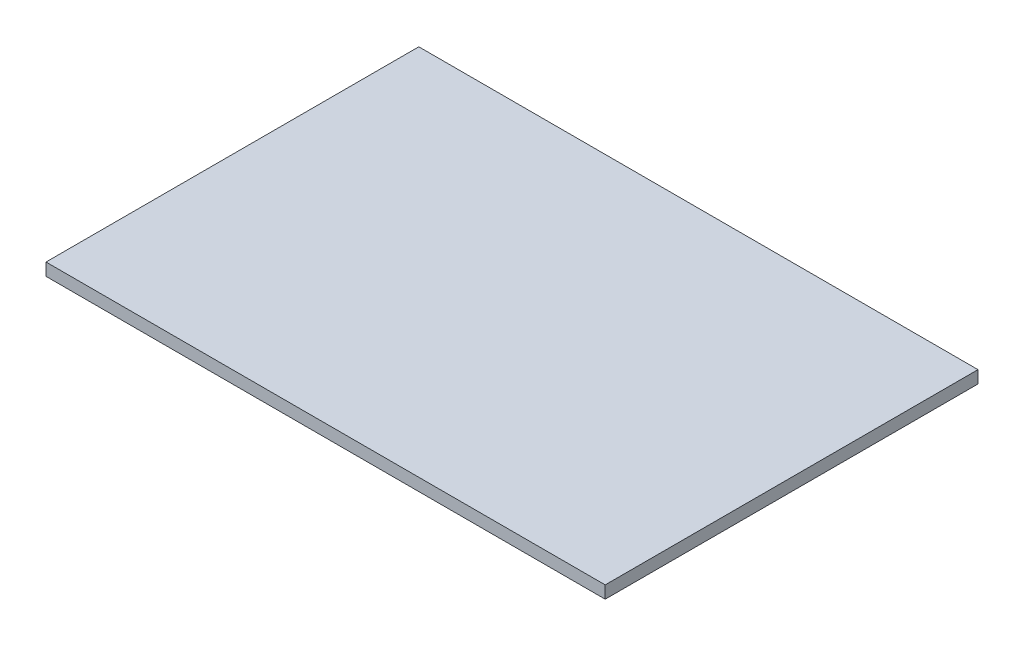
ISO-10303-21;
HEADER;
FILE_DESCRIPTION(('STEP AP214'),'2;1');
FILE_NAME('part.step','',(''),(''),'','','');
FILE_SCHEMA(('AUTOMOTIVE_DESIGN { 1 0 10303 214 1 1 1 1 }'));
ENDSEC;
DATA;
#1=APPLICATION_CONTEXT('core data for automotive mechanical design processes');
#2=APPLICATION_PROTOCOL_DEFINITION('international standard','automotive_design',2000,#1);
#3=PRODUCT_CONTEXT('',#1,'mechanical');
#4=PRODUCT('Part','Part','',(#3));
#5=PRODUCT_RELATED_PRODUCT_CATEGORY('part','',(#4));
#6=PRODUCT_DEFINITION_FORMATION('','',#4);
#7=PRODUCT_DEFINITION_CONTEXT('part definition',#1,'design');
#8=PRODUCT_DEFINITION('design','',#6,#7);
#9=PRODUCT_DEFINITION_SHAPE('','',#8);
#10=(LENGTH_UNIT() NAMED_UNIT(*) SI_UNIT(.MILLI.,.METRE.));
#11=(NAMED_UNIT(*) PLANE_ANGLE_UNIT() SI_UNIT($,.RADIAN.));
#12=(NAMED_UNIT(*) SI_UNIT($,.STERADIAN.) SOLID_ANGLE_UNIT());
#13=UNCERTAINTY_MEASURE_WITH_UNIT(LENGTH_MEASURE(1.E-05),#10,'distance_accuracy_value','');
#14=(GEOMETRIC_REPRESENTATION_CONTEXT(3) GLOBAL_UNCERTAINTY_ASSIGNED_CONTEXT((#13)) GLOBAL_UNIT_ASSIGNED_CONTEXT((#10,
#11,#12)) REPRESENTATION_CONTEXT('',''));
#15=CARTESIAN_POINT('',(0.,0.,0.));
#16=DIRECTION('',(0.,0.,1.));
#17=DIRECTION('',(1.,0.,0.));
#18=AXIS2_PLACEMENT_3D('',#15,#16,#17);
#19=CARTESIAN_POINT('',(-90.,4.,60.));
#20=DIRECTION('',(1.,0.,0.));
#21=DIRECTION('',(0.,0.,-1.));
#22=AXIS2_PLACEMENT_3D('',#19,#20,#21);
#23=PLANE('',#22);
#24=DIRECTION('',(0.,0.,1.));
#25=VECTOR('',#24,1.);
#26=CARTESIAN_POINT('',(-90.,0.,60.));
#27=LINE('',#26,#25);
#28=CARTESIAN_POINT('',(-90.,0.,-60.));
#29=VERTEX_POINT('',#28);
#30=CARTESIAN_POINT('',(-90.,0.,60.));
#31=VERTEX_POINT('',#30);
#32=EDGE_CURVE('E105',#29,#31,#27,.T.);
#33=ORIENTED_EDGE('',*,*,#32,.T.);
#34=DIRECTION('',(0.,-1.,0.));
#35=VECTOR('',#34,1.);
#36=CARTESIAN_POINT('',(-90.,4.,60.));
#37=LINE('',#36,#35);
#38=CARTESIAN_POINT('',(-90.,4.,60.));
#39=VERTEX_POINT('',#38);
#40=EDGE_CURVE('E11',#39,#31,#37,.T.);
#41=ORIENTED_EDGE('',*,*,#40,.F.);
#42=DIRECTION('',(0.,0.,1.));
#43=VECTOR('',#42,1.);
#44=CARTESIAN_POINT('',(-90.,4.,60.));
#45=LINE('',#44,#43);
#46=CARTESIAN_POINT('',(-90.,4.,-60.));
#47=VERTEX_POINT('',#46);
#48=EDGE_CURVE('E89',#47,#39,#45,.T.);
#49=ORIENTED_EDGE('',*,*,#48,.F.);
#50=DIRECTION('',(0.,-1.,0.));
#51=VECTOR('',#50,1.);
#52=CARTESIAN_POINT('',(-90.,4.,-60.));
#53=LINE('',#52,#51);
#54=EDGE_CURVE('E98',#47,#29,#53,.T.);
#55=ORIENTED_EDGE('',*,*,#54,.T.);
#56=EDGE_LOOP('',(#33,#41,#49,#55));
#57=FACE_BOUND('',#56,.T.);
#58=ADVANCED_FACE('F39',(#57),#23,.F.);
#59=CARTESIAN_POINT('',(90.,4.,60.));
#60=DIRECTION('',(0.,0.,-1.));
#61=DIRECTION('',(-1.,0.,0.));
#62=AXIS2_PLACEMENT_3D('',#59,#60,#61);
#63=PLANE('',#62);
#64=DIRECTION('',(1.,0.,0.));
#65=VECTOR('',#64,1.);
#66=CARTESIAN_POINT('',(90.,0.,60.));
#67=LINE('',#66,#65);
#68=CARTESIAN_POINT('',(90.,0.,60.));
#69=VERTEX_POINT('',#68);
#70=EDGE_CURVE('E94',#31,#69,#67,.T.);
#71=ORIENTED_EDGE('',*,*,#70,.T.);
#72=DIRECTION('',(0.,-1.,0.));
#73=VECTOR('',#72,1.);
#74=CARTESIAN_POINT('',(90.,4.,60.));
#75=LINE('',#74,#73);
#76=CARTESIAN_POINT('',(90.,4.,60.));
#77=VERTEX_POINT('',#76);
#78=EDGE_CURVE('E50',#77,#69,#75,.T.);
#79=ORIENTED_EDGE('',*,*,#78,.F.);
#80=DIRECTION('',(1.,0.,0.));
#81=VECTOR('',#80,1.);
#82=CARTESIAN_POINT('',(90.,4.,60.));
#83=LINE('',#82,#81);
#84=EDGE_CURVE('E82',#39,#77,#83,.T.);
#85=ORIENTED_EDGE('',*,*,#84,.F.);
#86=ORIENTED_EDGE('',*,*,#40,.T.);
#87=EDGE_LOOP('',(#71,#79,#85,#86));
#88=FACE_BOUND('',#87,.T.);
#89=ADVANCED_FACE('F91',(#88),#63,.F.);
#90=CARTESIAN_POINT('',(90.,4.,60.));
#91=DIRECTION('',(-1.,0.,0.));
#92=DIRECTION('',(0.,0.,1.));
#93=AXIS2_PLACEMENT_3D('',#90,#91,#92);
#94=PLANE('',#93);
#95=DIRECTION('',(0.,0.,-1.));
#96=VECTOR('',#95,1.);
#97=CARTESIAN_POINT('',(90.,0.,60.));
#98=LINE('',#97,#96);
#99=CARTESIAN_POINT('',(90.,0.,-60.));
#100=VERTEX_POINT('',#99);
#101=EDGE_CURVE('E75',#69,#100,#98,.T.);
#102=ORIENTED_EDGE('',*,*,#101,.T.);
#103=DIRECTION('',(0.,-1.,0.));
#104=VECTOR('',#103,1.);
#105=CARTESIAN_POINT('',(90.,4.,-60.));
#106=LINE('',#105,#104);
#107=CARTESIAN_POINT('',(90.,4.,-60.));
#108=VERTEX_POINT('',#107);
#109=EDGE_CURVE('E92',#108,#100,#106,.T.);
#110=ORIENTED_EDGE('',*,*,#109,.F.);
#111=DIRECTION('',(0.,0.,-1.));
#112=VECTOR('',#111,1.);
#113=CARTESIAN_POINT('',(90.,4.,60.));
#114=LINE('',#113,#112);
#115=EDGE_CURVE('E86',#77,#108,#114,.T.);
#116=ORIENTED_EDGE('',*,*,#115,.F.);
#117=ORIENTED_EDGE('',*,*,#78,.T.);
#118=EDGE_LOOP('',(#102,#110,#116,#117));
#119=FACE_BOUND('',#118,.T.);
#120=ADVANCED_FACE('F96',(#119),#94,.F.);
#121=CARTESIAN_POINT('',(90.,4.,-60.));
#122=DIRECTION('',(0.,0.,1.));
#123=DIRECTION('',(1.,0.,0.));
#124=AXIS2_PLACEMENT_3D('',#121,#122,#123);
#125=PLANE('',#124);
#126=DIRECTION('',(-1.,0.,0.));
#127=VECTOR('',#126,1.);
#128=CARTESIAN_POINT('',(90.,0.,-60.));
#129=LINE('',#128,#127);
#130=EDGE_CURVE('E79',#100,#29,#129,.T.);
#131=ORIENTED_EDGE('',*,*,#130,.T.);
#132=ORIENTED_EDGE('',*,*,#54,.F.);
#133=DIRECTION('',(-1.,0.,0.));
#134=VECTOR('',#133,1.);
#135=CARTESIAN_POINT('',(90.,4.,-60.));
#136=LINE('',#135,#134);
#137=EDGE_CURVE('E54',#108,#47,#136,.T.);
#138=ORIENTED_EDGE('',*,*,#137,.F.);
#139=ORIENTED_EDGE('',*,*,#109,.T.);
#140=EDGE_LOOP('',(#131,#132,#138,#139));
#141=FACE_BOUND('',#140,.T.);
#142=ADVANCED_FACE('F108',(#141),#125,.F.);
#143=CARTESIAN_POINT('',(0.,4.,0.));
#144=DIRECTION('',(0.,1.,0.));
#145=DIRECTION('',(0.,0.,1.));
#146=AXIS2_PLACEMENT_3D('',#143,#144,#145);
#147=PLANE('',#146);
#148=ORIENTED_EDGE('',*,*,#48,.T.);
#149=ORIENTED_EDGE('',*,*,#84,.T.);
#150=ORIENTED_EDGE('',*,*,#115,.T.);
#151=ORIENTED_EDGE('',*,*,#137,.T.);
#152=EDGE_LOOP('',(#148,#149,#150,#151));
#153=FACE_BOUND('',#152,.T.);
#154=ADVANCED_FACE('F88',(#153),#147,.T.);
#155=CARTESIAN_POINT('',(0.,0.,0.));
#156=DIRECTION('',(0.,1.,0.));
#157=DIRECTION('',(0.,0.,1.));
#158=AXIS2_PLACEMENT_3D('',#155,#156,#157);
#159=PLANE('',#158);
#160=ORIENTED_EDGE('',*,*,#32,.F.);
#161=ORIENTED_EDGE('',*,*,#130,.F.);
#162=ORIENTED_EDGE('',*,*,#101,.F.);
#163=ORIENTED_EDGE('',*,*,#70,.F.);
#164=EDGE_LOOP('',(#160,#161,#162,#163));
#165=FACE_BOUND('',#164,.T.);
#166=ADVANCED_FACE('F115',(#165),#159,.F.);
#167=CLOSED_SHELL('',(#58,#89,#120,#142,#154,#166));
#168=MANIFOLD_SOLID_BREP('B2',#167);
#169=ADVANCED_BREP_SHAPE_REPRESENTATION('',(#18,#168),#14);
#170=SHAPE_DEFINITION_REPRESENTATION(#9,#169);
ENDSEC;
END-ISO-10303-21;
